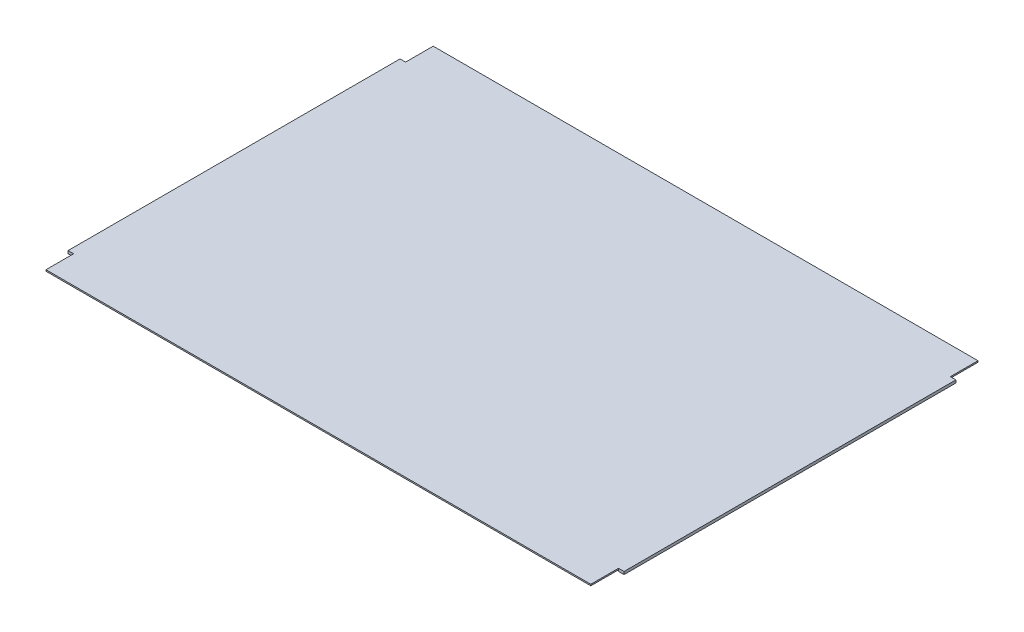
ISO-10303-21;
HEADER;
FILE_DESCRIPTION(('STEP AP214'),'2;1');
FILE_NAME('part.step','',(''),(''),'','','');
FILE_SCHEMA(('AUTOMOTIVE_DESIGN { 1 0 10303 214 1 1 1 1 }'));
ENDSEC;
DATA;
#1=APPLICATION_CONTEXT('core data for automotive mechanical design processes');
#2=APPLICATION_PROTOCOL_DEFINITION('international standard','automotive_design',2000,#1);
#3=PRODUCT_CONTEXT('',#1,'mechanical');
#4=PRODUCT('Part','Part','',(#3));
#5=PRODUCT_RELATED_PRODUCT_CATEGORY('part','',(#4));
#6=PRODUCT_DEFINITION_FORMATION('','',#4);
#7=PRODUCT_DEFINITION_CONTEXT('part definition',#1,'design');
#8=PRODUCT_DEFINITION('design','',#6,#7);
#9=PRODUCT_DEFINITION_SHAPE('','',#8);
#10=(LENGTH_UNIT() NAMED_UNIT(*) SI_UNIT(.MILLI.,.METRE.));
#11=(NAMED_UNIT(*) PLANE_ANGLE_UNIT() SI_UNIT($,.RADIAN.));
#12=(NAMED_UNIT(*) SI_UNIT($,.STERADIAN.) SOLID_ANGLE_UNIT());
#13=UNCERTAINTY_MEASURE_WITH_UNIT(LENGTH_MEASURE(1.E-05),#10,'distance_accuracy_value','');
#14=(GEOMETRIC_REPRESENTATION_CONTEXT(3) GLOBAL_UNCERTAINTY_ASSIGNED_CONTEXT((#13)) GLOBAL_UNIT_ASSIGNED_CONTEXT((#10,
#11,#12)) REPRESENTATION_CONTEXT('',''));
#15=CARTESIAN_POINT('',(0.,0.,0.));
#16=DIRECTION('',(0.,0.,1.));
#17=DIRECTION('',(1.,0.,0.));
#18=AXIS2_PLACEMENT_3D('',#15,#16,#17);
#19=CARTESIAN_POINT('',(0.,0.,0.));
#20=DIRECTION('',(0.,1.,0.));
#21=DIRECTION('',(0.,0.,1.));
#22=AXIS2_PLACEMENT_3D('',#19,#20,#21);
#23=PLANE('',#22);
#24=DIRECTION('',(0.,0.,-1.));
#25=VECTOR('',#24,1.);
#26=CARTESIAN_POINT('',(-98.5,0.,0.));
#27=LINE('',#26,#25);
#28=CARTESIAN_POINT('',(-98.5,0.,60.));
#29=VERTEX_POINT('',#28);
#30=CARTESIAN_POINT('',(-98.5,0.,-60.));
#31=VERTEX_POINT('',#30);
#32=EDGE_CURVE('E11',#29,#31,#27,.T.);
#33=ORIENTED_EDGE('',*,*,#32,.F.);
#34=DIRECTION('',(1.,0.,0.));
#35=VECTOR('',#34,1.);
#36=CARTESIAN_POINT('',(-98.5,0.,60.));
#37=LINE('',#36,#35);
#38=CARTESIAN_POINT('',(-100.5,0.,60.));
#39=VERTEX_POINT('',#38);
#40=EDGE_CURVE('E157',#39,#29,#37,.T.);
#41=ORIENTED_EDGE('',*,*,#40,.F.);
#42=DIRECTION('',(0.,0.,1.));
#43=VECTOR('',#42,1.);
#44=CARTESIAN_POINT('',(-100.5,0.,-60.));
#45=LINE('',#44,#43);
#46=CARTESIAN_POINT('',(-100.5,0.,-60.));
#47=VERTEX_POINT('',#46);
#48=EDGE_CURVE('E153',#47,#39,#45,.T.);
#49=ORIENTED_EDGE('',*,*,#48,.F.);
#50=DIRECTION('',(-1.,0.,0.));
#51=VECTOR('',#50,1.);
#52=CARTESIAN_POINT('',(-98.5,0.,-60.));
#53=LINE('',#52,#51);
#54=EDGE_CURVE('E150',#31,#47,#53,.T.);
#55=ORIENTED_EDGE('',*,*,#54,.F.);
#56=EDGE_LOOP('',(#33,#41,#49,#55));
#57=FACE_BOUND('',#56,.T.);
#58=ADVANCED_FACE('F39',(#57),#23,.F.);
#59=DIRECTION('',(0.,0.,1.));
#60=VECTOR('',#59,1.);
#61=CARTESIAN_POINT('',(98.5,0.,0.));
#62=LINE('',#61,#60);
#63=CARTESIAN_POINT('',(98.5,0.,-60.));
#64=VERTEX_POINT('',#63);
#65=CARTESIAN_POINT('',(98.5,0.,60.));
#66=VERTEX_POINT('',#65);
#67=EDGE_CURVE('E49',#64,#66,#62,.T.);
#68=ORIENTED_EDGE('',*,*,#67,.F.);
#69=DIRECTION('',(-1.,0.,0.));
#70=VECTOR('',#69,1.);
#71=CARTESIAN_POINT('',(98.5,0.,-60.));
#72=LINE('',#71,#70);
#73=CARTESIAN_POINT('',(100.5,0.,-60.));
#74=VERTEX_POINT('',#73);
#75=EDGE_CURVE('E166',#74,#64,#72,.T.);
#76=ORIENTED_EDGE('',*,*,#75,.F.);
#77=DIRECTION('',(0.,0.,-1.));
#78=VECTOR('',#77,1.);
#79=CARTESIAN_POINT('',(100.5,0.,-60.));
#80=LINE('',#79,#78);
#81=CARTESIAN_POINT('',(100.5,0.,60.));
#82=VERTEX_POINT('',#81);
#83=EDGE_CURVE('E78',#82,#74,#80,.T.);
#84=ORIENTED_EDGE('',*,*,#83,.F.);
#85=DIRECTION('',(1.,0.,0.));
#86=VECTOR('',#85,1.);
#87=CARTESIAN_POINT('',(98.5,0.,60.));
#88=LINE('',#87,#86);
#89=EDGE_CURVE('E161',#66,#82,#88,.T.);
#90=ORIENTED_EDGE('',*,*,#89,.F.);
#91=EDGE_LOOP('',(#68,#76,#84,#90));
#92=FACE_BOUND('',#91,.T.);
#93=ADVANCED_FACE('F225',(#92),#23,.F.);
#94=CARTESIAN_POINT('',(-98.5,1.,-70.));
#95=DIRECTION('',(0.,0.,1.));
#96=DIRECTION('',(1.,0.,0.));
#97=AXIS2_PLACEMENT_3D('',#94,#95,#96);
#98=PLANE('',#97);
#99=DIRECTION('',(0.,-1.,0.));
#100=VECTOR('',#99,1.);
#101=CARTESIAN_POINT('',(98.5,1.,-70.));
#102=LINE('',#101,#100);
#103=CARTESIAN_POINT('',(98.5,1.,-70.));
#104=VERTEX_POINT('',#103);
#105=CARTESIAN_POINT('',(98.5,0.5,-70.));
#106=VERTEX_POINT('',#105);
#107=EDGE_CURVE('E146',#104,#106,#102,.T.);
#108=ORIENTED_EDGE('',*,*,#107,.T.);
#109=DIRECTION('',(-1.,0.,0.));
#110=VECTOR('',#109,1.);
#111=CARTESIAN_POINT('',(-98.5,0.5,-70.));
#112=LINE('',#111,#110);
#113=CARTESIAN_POINT('',(-98.5,0.5,-70.));
#114=VERTEX_POINT('',#113);
#115=EDGE_CURVE('E231',#106,#114,#112,.T.);
#116=ORIENTED_EDGE('',*,*,#115,.T.);
#117=DIRECTION('',(0.,-1.,0.));
#118=VECTOR('',#117,1.);
#119=CARTESIAN_POINT('',(-98.5,1.,-70.));
#120=LINE('',#119,#118);
#121=CARTESIAN_POINT('',(-98.5,1.,-70.));
#122=VERTEX_POINT('',#121);
#123=EDGE_CURVE('E205',#122,#114,#120,.T.);
#124=ORIENTED_EDGE('',*,*,#123,.F.);
#125=DIRECTION('',(-1.,0.,0.));
#126=VECTOR('',#125,1.);
#127=CARTESIAN_POINT('',(-98.5,1.,-70.));
#128=LINE('',#127,#126);
#129=EDGE_CURVE('E169',#104,#122,#128,.T.);
#130=ORIENTED_EDGE('',*,*,#129,.F.);
#131=EDGE_LOOP('',(#108,#116,#124,#130));
#132=FACE_BOUND('',#131,.T.);
#133=ADVANCED_FACE('F41',(#132),#98,.F.);
#134=CARTESIAN_POINT('',(-98.5,1.,-60.));
#135=DIRECTION('',(1.,0.,0.));
#136=DIRECTION('',(0.,0.,-1.));
#137=AXIS2_PLACEMENT_3D('',#134,#135,#136);
#138=PLANE('',#137);
#139=ORIENTED_EDGE('',*,*,#123,.T.);
#140=DIRECTION('',(0.,0.,1.));
#141=VECTOR('',#140,1.);
#142=CARTESIAN_POINT('',(-98.5,0.5,-70.));
#143=LINE('',#142,#141);
#144=CARTESIAN_POINT('',(-98.5,0.5,-60.));
#145=VERTEX_POINT('',#144);
#146=EDGE_CURVE('E290',#114,#145,#143,.T.);
#147=ORIENTED_EDGE('',*,*,#146,.T.);
#148=DIRECTION('',(0.,-1.,0.));
#149=VECTOR('',#148,1.);
#150=CARTESIAN_POINT('',(-98.5,1.,-60.));
#151=LINE('',#150,#149);
#152=CARTESIAN_POINT('',(-98.5,1.,-60.));
#153=VERTEX_POINT('',#152);
#154=EDGE_CURVE('E201',#153,#145,#151,.T.);
#155=ORIENTED_EDGE('',*,*,#154,.F.);
#156=DIRECTION('',(0.,0.,1.));
#157=VECTOR('',#156,1.);
#158=CARTESIAN_POINT('',(-98.5,1.,-60.));
#159=LINE('',#158,#157);
#160=EDGE_CURVE('E95',#122,#153,#159,.T.);
#161=ORIENTED_EDGE('',*,*,#160,.F.);
#162=EDGE_LOOP('',(#139,#147,#155,#161));
#163=FACE_BOUND('',#162,.T.);
#164=ADVANCED_FACE('F445',(#163),#138,.F.);
#165=CARTESIAN_POINT('',(-98.5,1.,-60.));
#166=DIRECTION('',(0.,0.,1.));
#167=DIRECTION('',(1.,0.,0.));
#168=AXIS2_PLACEMENT_3D('',#165,#166,#167);
#169=PLANE('',#168);
#170=ORIENTED_EDGE('',*,*,#54,.T.);
#171=DIRECTION('',(0.,-1.,0.));
#172=VECTOR('',#171,1.);
#173=CARTESIAN_POINT('',(-100.5,1.,-60.));
#174=LINE('',#173,#172);
#175=CARTESIAN_POINT('',(-100.5,1.,-60.));
#176=VERTEX_POINT('',#175);
#177=EDGE_CURVE('E197',#176,#47,#174,.T.);
#178=ORIENTED_EDGE('',*,*,#177,.F.);
#179=DIRECTION('',(-1.,0.,0.));
#180=VECTOR('',#179,1.);
#181=CARTESIAN_POINT('',(-98.5,1.,-60.));
#182=LINE('',#181,#180);
#183=EDGE_CURVE('E245',#153,#176,#182,.T.);
#184=ORIENTED_EDGE('',*,*,#183,.F.);
#185=ORIENTED_EDGE('',*,*,#154,.T.);
#186=DIRECTION('',(0.,1.,0.));
#187=VECTOR('',#186,1.);
#188=CARTESIAN_POINT('',(-98.5,1.,-60.));
#189=LINE('',#188,#187);
#190=EDGE_CURVE('E154',#31,#145,#189,.T.);
#191=ORIENTED_EDGE('',*,*,#190,.F.);
#192=EDGE_LOOP('',(#170,#178,#184,#185,#191));
#193=FACE_BOUND('',#192,.T.);
#194=ADVANCED_FACE('F437',(#193),#169,.F.);
#195=CARTESIAN_POINT('',(-100.5,1.,-60.));
#196=DIRECTION('',(1.,0.,0.));
#197=DIRECTION('',(0.,0.,-1.));
#198=AXIS2_PLACEMENT_3D('',#195,#196,#197);
#199=PLANE('',#198);
#200=ORIENTED_EDGE('',*,*,#48,.T.);
#201=DIRECTION('',(0.,-1.,0.));
#202=VECTOR('',#201,1.);
#203=CARTESIAN_POINT('',(-100.5,1.,60.));
#204=LINE('',#203,#202);
#205=CARTESIAN_POINT('',(-100.5,1.,60.));
#206=VERTEX_POINT('',#205);
#207=EDGE_CURVE('E193',#206,#39,#204,.T.);
#208=ORIENTED_EDGE('',*,*,#207,.F.);
#209=DIRECTION('',(0.,0.,1.));
#210=VECTOR('',#209,1.);
#211=CARTESIAN_POINT('',(-100.5,1.,-60.));
#212=LINE('',#211,#210);
#213=EDGE_CURVE('E252',#176,#206,#212,.T.);
#214=ORIENTED_EDGE('',*,*,#213,.F.);
#215=ORIENTED_EDGE('',*,*,#177,.T.);
#216=EDGE_LOOP('',(#200,#208,#214,#215));
#217=FACE_BOUND('',#216,.T.);
#218=ADVANCED_FACE('F428',(#217),#199,.F.);
#219=CARTESIAN_POINT('',(-98.5,1.,60.));
#220=DIRECTION('',(0.,0.,-1.));
#221=DIRECTION('',(-1.,0.,0.));
#222=AXIS2_PLACEMENT_3D('',#219,#220,#221);
#223=PLANE('',#222);
#224=ORIENTED_EDGE('',*,*,#40,.T.);
#225=DIRECTION('',(0.,-1.,0.));
#226=VECTOR('',#225,1.);
#227=CARTESIAN_POINT('',(-98.5,1.,60.));
#228=LINE('',#227,#226);
#229=CARTESIAN_POINT('',(-98.5,0.5,60.));
#230=VERTEX_POINT('',#229);
#231=EDGE_CURVE('E223',#230,#29,#228,.T.);
#232=ORIENTED_EDGE('',*,*,#231,.F.);
#233=DIRECTION('',(0.,-1.,0.));
#234=VECTOR('',#233,1.);
#235=CARTESIAN_POINT('',(-98.5,1.,60.));
#236=LINE('',#235,#234);
#237=CARTESIAN_POINT('',(-98.5,1.,60.));
#238=VERTEX_POINT('',#237);
#239=EDGE_CURVE('E189',#238,#230,#236,.T.);
#240=ORIENTED_EDGE('',*,*,#239,.F.);
#241=DIRECTION('',(1.,0.,0.));
#242=VECTOR('',#241,1.);
#243=CARTESIAN_POINT('',(-98.5,1.,60.));
#244=LINE('',#243,#242);
#245=EDGE_CURVE('E255',#206,#238,#244,.T.);
#246=ORIENTED_EDGE('',*,*,#245,.F.);
#247=ORIENTED_EDGE('',*,*,#207,.T.);
#248=EDGE_LOOP('',(#224,#232,#240,#246,#247));
#249=FACE_BOUND('',#248,.T.);
#250=ADVANCED_FACE('F320',(#249),#223,.F.);
#251=CARTESIAN_POINT('',(-98.5,1.,60.));
#252=DIRECTION('',(1.,0.,0.));
#253=DIRECTION('',(0.,0.,-1.));
#254=AXIS2_PLACEMENT_3D('',#251,#252,#253);
#255=PLANE('',#254);
#256=ORIENTED_EDGE('',*,*,#239,.T.);
#257=CARTESIAN_POINT('',(-98.5,0.5,70.));
#258=VERTEX_POINT('',#257);
#259=EDGE_CURVE('E296',#230,#258,#143,.T.);
#260=ORIENTED_EDGE('',*,*,#259,.T.);
#261=DIRECTION('',(0.,-1.,0.));
#262=VECTOR('',#261,1.);
#263=CARTESIAN_POINT('',(-98.5,1.,70.));
#264=LINE('',#263,#262);
#265=CARTESIAN_POINT('',(-98.5,1.,70.));
#266=VERTEX_POINT('',#265);
#267=EDGE_CURVE('E185',#266,#258,#264,.T.);
#268=ORIENTED_EDGE('',*,*,#267,.F.);
#269=DIRECTION('',(0.,0.,1.));
#270=VECTOR('',#269,1.);
#271=CARTESIAN_POINT('',(-98.5,1.,60.));
#272=LINE('',#271,#270);
#273=EDGE_CURVE('E258',#238,#266,#272,.T.);
#274=ORIENTED_EDGE('',*,*,#273,.F.);
#275=EDGE_LOOP('',(#256,#260,#268,#274));
#276=FACE_BOUND('',#275,.T.);
#277=ADVANCED_FACE('F307',(#276),#255,.F.);
#278=CARTESIAN_POINT('',(-98.5,1.,70.));
#279=DIRECTION('',(0.,0.,-1.));
#280=DIRECTION('',(-1.,0.,0.));
#281=AXIS2_PLACEMENT_3D('',#278,#279,#280);
#282=PLANE('',#281);
#283=ORIENTED_EDGE('',*,*,#267,.T.);
#284=DIRECTION('',(1.,0.,0.));
#285=VECTOR('',#284,1.);
#286=CARTESIAN_POINT('',(-98.5,0.5,70.));
#287=LINE('',#286,#285);
#288=CARTESIAN_POINT('',(98.5,0.5,70.));
#289=VERTEX_POINT('',#288);
#290=EDGE_CURVE('E288',#258,#289,#287,.T.);
#291=ORIENTED_EDGE('',*,*,#290,.T.);
#292=DIRECTION('',(0.,-1.,0.));
#293=VECTOR('',#292,1.);
#294=CARTESIAN_POINT('',(98.5,1.,70.));
#295=LINE('',#294,#293);
#296=CARTESIAN_POINT('',(98.5,1.,70.));
#297=VERTEX_POINT('',#296);
#298=EDGE_CURVE('E181',#297,#289,#295,.T.);
#299=ORIENTED_EDGE('',*,*,#298,.F.);
#300=DIRECTION('',(1.,0.,0.));
#301=VECTOR('',#300,1.);
#302=CARTESIAN_POINT('',(-98.5,1.,70.));
#303=LINE('',#302,#301);
#304=EDGE_CURVE('E261',#266,#297,#303,.T.);
#305=ORIENTED_EDGE('',*,*,#304,.F.);
#306=EDGE_LOOP('',(#283,#291,#299,#305));
#307=FACE_BOUND('',#306,.T.);
#308=ADVANCED_FACE('F312',(#307),#282,.F.);
#309=CARTESIAN_POINT('',(98.5,1.,60.));
#310=DIRECTION('',(-1.,0.,0.));
#311=DIRECTION('',(0.,0.,1.));
#312=AXIS2_PLACEMENT_3D('',#309,#310,#311);
#313=PLANE('',#312);
#314=ORIENTED_EDGE('',*,*,#298,.T.);
#315=DIRECTION('',(0.,0.,-1.));
#316=VECTOR('',#315,1.);
#317=CARTESIAN_POINT('',(98.5,0.5,-70.));
#318=LINE('',#317,#316);
#319=CARTESIAN_POINT('',(98.5,0.5,60.));
#320=VERTEX_POINT('',#319);
#321=EDGE_CURVE('E274',#289,#320,#318,.T.);
#322=ORIENTED_EDGE('',*,*,#321,.T.);
#323=DIRECTION('',(0.,-1.,0.));
#324=VECTOR('',#323,1.);
#325=CARTESIAN_POINT('',(98.5,1.,60.));
#326=LINE('',#325,#324);
#327=CARTESIAN_POINT('',(98.5,1.,60.));
#328=VERTEX_POINT('',#327);
#329=EDGE_CURVE('E177',#328,#320,#326,.T.);
#330=ORIENTED_EDGE('',*,*,#329,.F.);
#331=DIRECTION('',(0.,0.,-1.));
#332=VECTOR('',#331,1.);
#333=CARTESIAN_POINT('',(98.5,1.,60.));
#334=LINE('',#333,#332);
#335=EDGE_CURVE('E264',#297,#328,#334,.T.);
#336=ORIENTED_EDGE('',*,*,#335,.F.);
#337=EDGE_LOOP('',(#314,#322,#330,#336));
#338=FACE_BOUND('',#337,.T.);
#339=ADVANCED_FACE('F272',(#338),#313,.F.);
#340=CARTESIAN_POINT('',(98.5,1.,60.));
#341=DIRECTION('',(0.,0.,-1.));
#342=DIRECTION('',(-1.,0.,0.));
#343=AXIS2_PLACEMENT_3D('',#340,#341,#342);
#344=PLANE('',#343);
#345=ORIENTED_EDGE('',*,*,#89,.T.);
#346=DIRECTION('',(0.,-1.,0.));
#347=VECTOR('',#346,1.);
#348=CARTESIAN_POINT('',(100.5,1.,60.));
#349=LINE('',#348,#347);
#350=CARTESIAN_POINT('',(100.5,1.,60.));
#351=VERTEX_POINT('',#350);
#352=EDGE_CURVE('E138',#351,#82,#349,.T.);
#353=ORIENTED_EDGE('',*,*,#352,.F.);
#354=DIRECTION('',(1.,0.,0.));
#355=VECTOR('',#354,1.);
#356=CARTESIAN_POINT('',(98.5,1.,60.));
#357=LINE('',#356,#355);
#358=EDGE_CURVE('E128',#328,#351,#357,.T.);
#359=ORIENTED_EDGE('',*,*,#358,.F.);
#360=ORIENTED_EDGE('',*,*,#329,.T.);
#361=DIRECTION('',(0.,1.,0.));
#362=VECTOR('',#361,1.);
#363=CARTESIAN_POINT('',(98.5,1.,60.));
#364=LINE('',#363,#362);
#365=EDGE_CURVE('E213',#66,#320,#364,.T.);
#366=ORIENTED_EDGE('',*,*,#365,.F.);
#367=EDGE_LOOP('',(#345,#353,#359,#360,#366));
#368=FACE_BOUND('',#367,.T.);
#369=ADVANCED_FACE('F220',(#368),#344,.F.);
#370=CARTESIAN_POINT('',(100.5,1.,-60.));
#371=DIRECTION('',(-1.,0.,0.));
#372=DIRECTION('',(0.,0.,1.));
#373=AXIS2_PLACEMENT_3D('',#370,#371,#372);
#374=PLANE('',#373);
#375=ORIENTED_EDGE('',*,*,#83,.T.);
#376=DIRECTION('',(0.,-1.,0.));
#377=VECTOR('',#376,1.);
#378=CARTESIAN_POINT('',(100.5,1.,-60.));
#379=LINE('',#378,#377);
#380=CARTESIAN_POINT('',(100.5,1.,-60.));
#381=VERTEX_POINT('',#380);
#382=EDGE_CURVE('E132',#381,#74,#379,.T.);
#383=ORIENTED_EDGE('',*,*,#382,.F.);
#384=DIRECTION('',(0.,0.,-1.));
#385=VECTOR('',#384,1.);
#386=CARTESIAN_POINT('',(100.5,1.,-60.));
#387=LINE('',#386,#385);
#388=EDGE_CURVE('E122',#351,#381,#387,.T.);
#389=ORIENTED_EDGE('',*,*,#388,.F.);
#390=ORIENTED_EDGE('',*,*,#352,.T.);
#391=EDGE_LOOP('',(#375,#383,#389,#390));
#392=FACE_BOUND('',#391,.T.);
#393=ADVANCED_FACE('F133',(#392),#374,.F.);
#394=CARTESIAN_POINT('',(98.5,1.,-60.));
#395=DIRECTION('',(0.,0.,1.));
#396=DIRECTION('',(1.,0.,0.));
#397=AXIS2_PLACEMENT_3D('',#394,#395,#396);
#398=PLANE('',#397);
#399=ORIENTED_EDGE('',*,*,#75,.T.);
#400=DIRECTION('',(0.,-1.,0.));
#401=VECTOR('',#400,1.);
#402=CARTESIAN_POINT('',(98.5,1.,-60.));
#403=LINE('',#402,#401);
#404=CARTESIAN_POINT('',(98.5,0.5,-60.));
#405=VERTEX_POINT('',#404);
#406=EDGE_CURVE('E86',#405,#64,#403,.T.);
#407=ORIENTED_EDGE('',*,*,#406,.F.);
#408=DIRECTION('',(0.,-1.,0.));
#409=VECTOR('',#408,1.);
#410=CARTESIAN_POINT('',(98.5,1.,-60.));
#411=LINE('',#410,#409);
#412=CARTESIAN_POINT('',(98.5,1.,-60.));
#413=VERTEX_POINT('',#412);
#414=EDGE_CURVE('E139',#413,#405,#411,.T.);
#415=ORIENTED_EDGE('',*,*,#414,.F.);
#416=DIRECTION('',(-1.,0.,0.));
#417=VECTOR('',#416,1.);
#418=CARTESIAN_POINT('',(98.5,1.,-60.));
#419=LINE('',#418,#417);
#420=EDGE_CURVE('E125',#381,#413,#419,.T.);
#421=ORIENTED_EDGE('',*,*,#420,.F.);
#422=ORIENTED_EDGE('',*,*,#382,.T.);
#423=EDGE_LOOP('',(#399,#407,#415,#421,#422));
#424=FACE_BOUND('',#423,.T.);
#425=ADVANCED_FACE('F141',(#424),#398,.F.);
#426=CARTESIAN_POINT('',(98.5,1.,-60.));
#427=DIRECTION('',(-1.,0.,0.));
#428=DIRECTION('',(0.,0.,1.));
#429=AXIS2_PLACEMENT_3D('',#426,#427,#428);
#430=PLANE('',#429);
#431=ORIENTED_EDGE('',*,*,#414,.T.);
#432=EDGE_CURVE('E237',#405,#106,#318,.T.);
#433=ORIENTED_EDGE('',*,*,#432,.T.);
#434=ORIENTED_EDGE('',*,*,#107,.F.);
#435=DIRECTION('',(0.,0.,-1.));
#436=VECTOR('',#435,1.);
#437=CARTESIAN_POINT('',(98.5,1.,-60.));
#438=LINE('',#437,#436);
#439=EDGE_CURVE('E57',#413,#104,#438,.T.);
#440=ORIENTED_EDGE('',*,*,#439,.F.);
#441=EDGE_LOOP('',(#431,#433,#434,#440));
#442=FACE_BOUND('',#441,.T.);
#443=ADVANCED_FACE('F235',(#442),#430,.F.);
#444=CARTESIAN_POINT('',(0.,1.,0.));
#445=DIRECTION('',(0.,1.,0.));
#446=DIRECTION('',(0.,0.,1.));
#447=AXIS2_PLACEMENT_3D('',#444,#445,#446);
#448=PLANE('',#447);
#449=ORIENTED_EDGE('',*,*,#129,.T.);
#450=ORIENTED_EDGE('',*,*,#160,.T.);
#451=ORIENTED_EDGE('',*,*,#183,.T.);
#452=ORIENTED_EDGE('',*,*,#213,.T.);
#453=ORIENTED_EDGE('',*,*,#245,.T.);
#454=ORIENTED_EDGE('',*,*,#273,.T.);
#455=ORIENTED_EDGE('',*,*,#304,.T.);
#456=ORIENTED_EDGE('',*,*,#335,.T.);
#457=ORIENTED_EDGE('',*,*,#358,.T.);
#458=ORIENTED_EDGE('',*,*,#388,.T.);
#459=ORIENTED_EDGE('',*,*,#420,.T.);
#460=ORIENTED_EDGE('',*,*,#439,.T.);
#461=EDGE_LOOP('',(#449,#450,#451,#452,#453,#454,#455,#456,#457,#458,#459,#460));
#462=FACE_BOUND('',#461,.T.);
#463=ADVANCED_FACE('F123',(#462),#448,.T.);
#464=CARTESIAN_POINT('',(-98.5,0.5,-70.));
#465=DIRECTION('',(1.,0.,0.));
#466=DIRECTION('',(0.,0.,-1.));
#467=AXIS2_PLACEMENT_3D('',#464,#465,#466);
#468=PLANE('',#467);
#469=ORIENTED_EDGE('',*,*,#190,.T.);
#470=EDGE_CURVE('E294',#145,#230,#143,.T.);
#471=ORIENTED_EDGE('',*,*,#470,.T.);
#472=ORIENTED_EDGE('',*,*,#231,.T.);
#473=ORIENTED_EDGE('',*,*,#32,.T.);
#474=EDGE_LOOP('',(#469,#471,#472,#473));
#475=FACE_BOUND('',#474,.T.);
#476=ADVANCED_FACE('F363',(#475),#468,.T.);
#477=CARTESIAN_POINT('',(98.5,0.5,-70.));
#478=DIRECTION('',(-1.,0.,0.));
#479=DIRECTION('',(0.,0.,1.));
#480=AXIS2_PLACEMENT_3D('',#477,#478,#479);
#481=PLANE('',#480);
#482=ORIENTED_EDGE('',*,*,#365,.T.);
#483=EDGE_CURVE('E281',#320,#405,#318,.T.);
#484=ORIENTED_EDGE('',*,*,#483,.T.);
#485=ORIENTED_EDGE('',*,*,#406,.T.);
#486=ORIENTED_EDGE('',*,*,#67,.T.);
#487=EDGE_LOOP('',(#482,#484,#485,#486));
#488=FACE_BOUND('',#487,.T.);
#489=ADVANCED_FACE('F211',(#488),#481,.T.);
#490=CARTESIAN_POINT('',(0.,0.5,0.));
#491=DIRECTION('',(0.,1.,0.));
#492=DIRECTION('',(0.,0.,1.));
#493=AXIS2_PLACEMENT_3D('',#490,#491,#492);
#494=PLANE('',#493);
#495=ORIENTED_EDGE('',*,*,#146,.F.);
#496=ORIENTED_EDGE('',*,*,#115,.F.);
#497=ORIENTED_EDGE('',*,*,#432,.F.);
#498=ORIENTED_EDGE('',*,*,#483,.F.);
#499=ORIENTED_EDGE('',*,*,#321,.F.);
#500=ORIENTED_EDGE('',*,*,#290,.F.);
#501=ORIENTED_EDGE('',*,*,#259,.F.);
#502=ORIENTED_EDGE('',*,*,#470,.F.);
#503=EDGE_LOOP('',(#495,#496,#497,#498,#499,#500,#501,#502));
#504=FACE_BOUND('',#503,.T.);
#505=ADVANCED_FACE('F374',(#504),#494,.F.);
#506=CLOSED_SHELL('',(#58,#93,#133,#164,#194,#218,#250,#277,#308,#339,#369,#393,#425,#443,#463,
#476,#489,#505));
#507=MANIFOLD_SOLID_BREP('B2',#506);
#508=ADVANCED_BREP_SHAPE_REPRESENTATION('',(#18,#507),#14);
#509=SHAPE_DEFINITION_REPRESENTATION(#9,#508);
ENDSEC;
END-ISO-10303-21;
